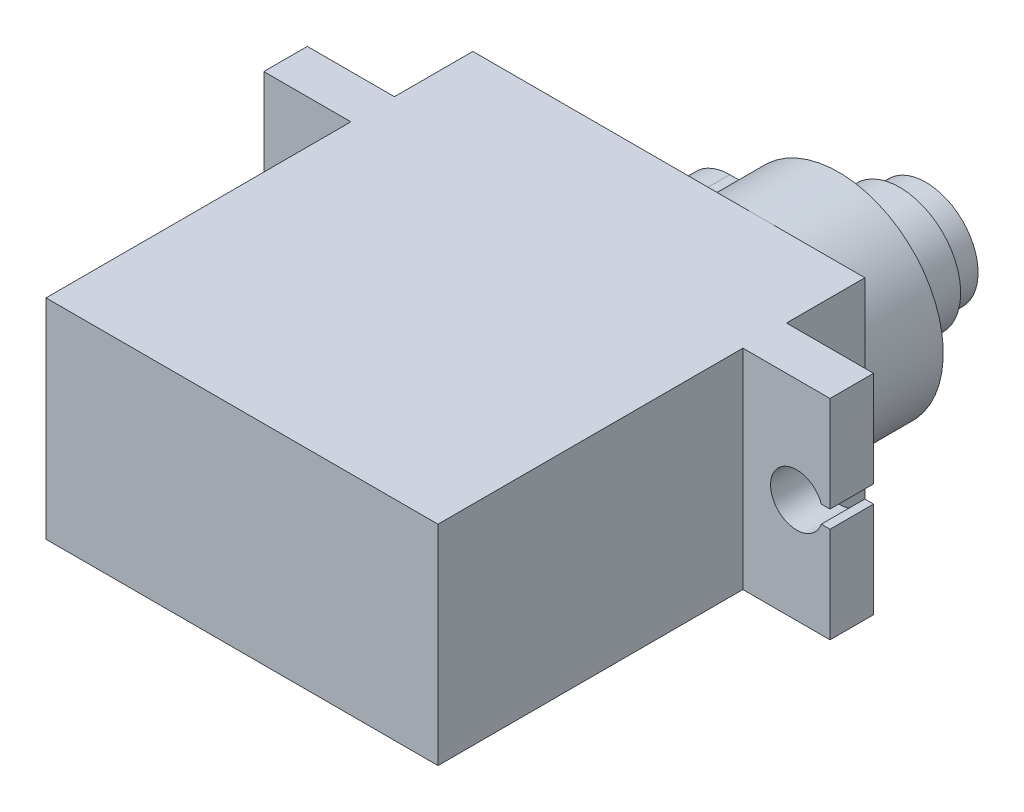
ISO-10303-21;
HEADER;
FILE_DESCRIPTION(('STEP AP214'),'2;1');
FILE_NAME('part.step','',(''),(''),'','','');
FILE_SCHEMA(('AUTOMOTIVE_DESIGN { 1 0 10303 214 1 1 1 1 }'));
ENDSEC;
DATA;
#1=APPLICATION_CONTEXT('core data for automotive mechanical design processes');
#2=APPLICATION_PROTOCOL_DEFINITION('international standard','automotive_design',2000,#1);
#3=PRODUCT_CONTEXT('',#1,'mechanical');
#4=PRODUCT('Part','Part','',(#3));
#5=PRODUCT_RELATED_PRODUCT_CATEGORY('part','',(#4));
#6=PRODUCT_DEFINITION_FORMATION('','',#4);
#7=PRODUCT_DEFINITION_CONTEXT('part definition',#1,'design');
#8=PRODUCT_DEFINITION('design','',#6,#7);
#9=PRODUCT_DEFINITION_SHAPE('','',#8);
#10=(LENGTH_UNIT() NAMED_UNIT(*) SI_UNIT(.MILLI.,.METRE.));
#11=(NAMED_UNIT(*) PLANE_ANGLE_UNIT() SI_UNIT($,.RADIAN.));
#12=(NAMED_UNIT(*) SI_UNIT($,.STERADIAN.) SOLID_ANGLE_UNIT());
#13=UNCERTAINTY_MEASURE_WITH_UNIT(LENGTH_MEASURE(1.E-05),#10,'distance_accuracy_value','');
#14=(GEOMETRIC_REPRESENTATION_CONTEXT(3) GLOBAL_UNCERTAINTY_ASSIGNED_CONTEXT((#13)) GLOBAL_UNIT_ASSIGNED_CONTEXT((#10,
#11,#12)) REPRESENTATION_CONTEXT('',''));
#15=CARTESIAN_POINT('',(0.,0.,0.));
#16=DIRECTION('',(0.,0.,1.));
#17=DIRECTION('',(1.,0.,0.));
#18=AXIS2_PLACEMENT_3D('',#15,#16,#17);
#19=CARTESIAN_POINT('',(5.25,0.,-14.));
#20=DIRECTION('',(0.,0.,1.));
#21=DIRECTION('',(1.,0.,0.));
#22=AXIS2_PLACEMENT_3D('',#19,#20,#21);
#23=CYLINDRICAL_SURFACE('',#22,3.5);
#24=CARTESIAN_POINT('',(5.25,0.,-9.));
#25=DIRECTION('',(0.,0.,-1.));
#26=DIRECTION('',(-1.,0.,0.));
#27=AXIS2_PLACEMENT_3D('',#24,#25,#26);
#28=CIRCLE('',#27,3.5);
#29=CARTESIAN_POINT('',(1.75,0.,-9.));
#30=VERTEX_POINT('',#29);
#31=EDGE_CURVE('E11',#30,#30,#28,.T.);
#32=ORIENTED_EDGE('',*,*,#31,.T.);
#33=EDGE_LOOP('',(#32));
#34=FACE_BOUND('',#33,.T.);
#35=CARTESIAN_POINT('',(5.25,0.,-12.5));
#36=DIRECTION('',(0.,0.,-1.));
#37=DIRECTION('',(-1.,0.,0.));
#38=AXIS2_PLACEMENT_3D('',#35,#36,#37);
#39=CIRCLE('',#38,3.5);
#40=CARTESIAN_POINT('',(1.75,0.,-12.5));
#41=VERTEX_POINT('',#40);
#42=EDGE_CURVE('E787',#41,#41,#39,.T.);
#43=ORIENTED_EDGE('',*,*,#42,.F.);
#44=EDGE_LOOP('',(#43));
#45=FACE_BOUND('',#44,.T.);
#46=ADVANCED_FACE('F35',(#34,#45),#23,.T.);
#47=CARTESIAN_POINT('',(0.,0.,-4.5));
#48=DIRECTION('',(0.,0.,1.));
#49=DIRECTION('',(1.,0.,0.));
#50=AXIS2_PLACEMENT_3D('',#47,#48,#49);
#51=PLANE('',#50);
#52=CARTESIAN_POINT('',(5.25,0.,-4.5));
#53=DIRECTION('',(0.,0.,-1.));
#54=DIRECTION('',(-1.,0.,0.));
#55=AXIS2_PLACEMENT_3D('',#52,#53,#54);
#56=CIRCLE('',#55,5.99999999999999);
#57=CARTESIAN_POINT('',(11.25,0.,-4.5));
#58=VERTEX_POINT('',#57);
#59=CARTESIAN_POINT('',(5.25,-6.,-4.5));
#60=VERTEX_POINT('',#59);
#61=EDGE_CURVE('E44',#58,#60,#56,.T.);
#62=ORIENTED_EDGE('',*,*,#61,.F.);
#63=DIRECTION('',(0.,-1.,0.));
#64=VECTOR('',#63,1.);
#65=CARTESIAN_POINT('',(11.25,-6.,-4.5));
#66=LINE('',#65,#64);
#67=CARTESIAN_POINT('',(11.25,-6.,-4.5));
#68=VERTEX_POINT('',#67);
#69=EDGE_CURVE('E243',#58,#68,#66,.T.);
#70=ORIENTED_EDGE('',*,*,#69,.T.);
#71=DIRECTION('',(-1.,0.,0.));
#72=VECTOR('',#71,1.);
#73=CARTESIAN_POINT('',(11.25,-6.,-4.5));
#74=LINE('',#73,#72);
#75=EDGE_CURVE('E248',#68,#60,#74,.T.);
#76=ORIENTED_EDGE('',*,*,#75,.T.);
#77=EDGE_LOOP('',(#62,#70,#76));
#78=FACE_BOUND('',#77,.T.);
#79=ADVANCED_FACE('F403',(#78),#51,.F.);
#80=CARTESIAN_POINT('',(-0.0826822519253796,-2.75,-4.5));
#81=VERTEX_POINT('',#80);
#82=EDGE_CURVE('E389',#60,#81,#56,.T.);
#83=ORIENTED_EDGE('',*,*,#82,.F.);
#84=CARTESIAN_POINT('',(-11.25,-6.,-4.5));
#85=VERTEX_POINT('',#84);
#86=EDGE_CURVE('E247',#60,#85,#74,.T.);
#87=ORIENTED_EDGE('',*,*,#86,.T.);
#88=DIRECTION('',(0.,1.,0.));
#89=VECTOR('',#88,1.);
#90=CARTESIAN_POINT('',(-11.25,-6.,-4.5));
#91=LINE('',#90,#89);
#92=CARTESIAN_POINT('',(-11.25,6.,-4.5));
#93=VERTEX_POINT('',#92);
#94=EDGE_CURVE('E236',#85,#93,#91,.T.);
#95=ORIENTED_EDGE('',*,*,#94,.T.);
#96=DIRECTION('',(1.,0.,0.));
#97=VECTOR('',#96,1.);
#98=CARTESIAN_POINT('',(11.25,6.,-4.5));
#99=LINE('',#98,#97);
#100=CARTESIAN_POINT('',(5.25,6.,-4.5));
#101=VERTEX_POINT('',#100);
#102=EDGE_CURVE('E240',#93,#101,#99,.T.);
#103=ORIENTED_EDGE('',*,*,#102,.T.);
#104=CARTESIAN_POINT('',(-0.0826822519253674,2.75,-4.5));
#105=VERTEX_POINT('',#104);
#106=EDGE_CURVE('E391',#105,#101,#56,.T.);
#107=ORIENTED_EDGE('',*,*,#106,.F.);
#108=DIRECTION('',(1.,0.,0.));
#109=VECTOR('',#108,1.);
#110=CARTESIAN_POINT('',(-0.99999999999999,2.75,-4.5));
#111=LINE('',#110,#109);
#112=CARTESIAN_POINT('',(-0.99999999999999,2.75,-4.5));
#113=VERTEX_POINT('',#112);
#114=EDGE_CURVE('E397',#113,#105,#111,.T.);
#115=ORIENTED_EDGE('',*,*,#114,.F.);
#116=CARTESIAN_POINT('',(-1.,0.,-4.5));
#117=DIRECTION('',(0.,0.,-1.));
#118=DIRECTION('',(-1.,0.,0.));
#119=AXIS2_PLACEMENT_3D('',#116,#117,#118);
#120=CIRCLE('',#119,2.75);
#121=CARTESIAN_POINT('',(-1.00000000000003,-2.75,-4.5));
#122=VERTEX_POINT('',#121);
#123=EDGE_CURVE('E57',#122,#113,#120,.T.);
#124=ORIENTED_EDGE('',*,*,#123,.F.);
#125=DIRECTION('',(-1.,0.,0.));
#126=VECTOR('',#125,1.);
#127=CARTESIAN_POINT('',(-1.00000000000003,-2.75,-4.5));
#128=LINE('',#127,#126);
#129=EDGE_CURVE('E52',#81,#122,#128,.T.);
#130=ORIENTED_EDGE('',*,*,#129,.F.);
#131=EDGE_LOOP('',(#83,#87,#95,#103,#107,#115,#124,#130));
#132=FACE_BOUND('',#131,.T.);
#133=ADVANCED_FACE('F422',(#132),#51,.F.);
#134=EDGE_CURVE('E384',#101,#58,#56,.T.);
#135=ORIENTED_EDGE('',*,*,#134,.F.);
#136=CARTESIAN_POINT('',(11.25,6.,-4.5));
#137=VERTEX_POINT('',#136);
#138=EDGE_CURVE('E239',#101,#137,#99,.T.);
#139=ORIENTED_EDGE('',*,*,#138,.T.);
#140=EDGE_CURVE('E244',#137,#58,#66,.T.);
#141=ORIENTED_EDGE('',*,*,#140,.T.);
#142=EDGE_LOOP('',(#135,#139,#141));
#143=FACE_BOUND('',#142,.T.);
#144=ADVANCED_FACE('F410',(#143),#51,.F.);
#145=CARTESIAN_POINT('',(-14.3357864376269,0.,0.));
#146=DIRECTION('',(0.,0.,1.));
#147=DIRECTION('',(1.,0.,0.));
#148=AXIS2_PLACEMENT_3D('',#145,#146,#147);
#149=PLANE('',#148);
#150=DIRECTION('',(0.,1.,0.));
#151=VECTOR('',#150,1.);
#152=CARTESIAN_POINT('',(-11.25,-6.,0.));
#153=LINE('',#152,#151);
#154=CARTESIAN_POINT('',(-11.25,-6.,0.));
#155=VERTEX_POINT('',#154);
#156=CARTESIAN_POINT('',(-11.25,5.99999999999999,0.));
#157=VERTEX_POINT('',#156);
#158=EDGE_CURVE('E227',#155,#157,#153,.T.);
#159=ORIENTED_EDGE('',*,*,#158,.F.);
#160=DIRECTION('',(1.,0.,0.));
#161=VECTOR('',#160,1.);
#162=CARTESIAN_POINT('',(-16.25,-6.,0.));
#163=LINE('',#162,#161);
#164=CARTESIAN_POINT('',(-16.25,-6.,0.));
#165=VERTEX_POINT('',#164);
#166=EDGE_CURVE('E346',#165,#155,#163,.T.);
#167=ORIENTED_EDGE('',*,*,#166,.F.);
#168=DIRECTION('',(0.,-1.,0.));
#169=VECTOR('',#168,1.);
#170=CARTESIAN_POINT('',(-16.25,-6.,0.));
#171=LINE('',#170,#169);
#172=CARTESIAN_POINT('',(-16.25,-0.500000000000002,0.));
#173=VERTEX_POINT('',#172);
#174=EDGE_CURVE('E343',#173,#165,#171,.T.);
#175=ORIENTED_EDGE('',*,*,#174,.F.);
#176=DIRECTION('',(-1.,0.,0.));
#177=VECTOR('',#176,1.);
#178=CARTESIAN_POINT('',(-15.75,-0.500000000000002,0.));
#179=LINE('',#178,#177);
#180=CARTESIAN_POINT('',(-15.75,-0.500000000000001,0.));
#181=VERTEX_POINT('',#180);
#182=EDGE_CURVE('E341',#181,#173,#179,.T.);
#183=ORIENTED_EDGE('',*,*,#182,.F.);
#184=CARTESIAN_POINT('',(-14.3357864376269,0.,0.));
#185=DIRECTION('',(0.,0.,-1.));
#186=DIRECTION('',(1.,0.,0.));
#187=AXIS2_PLACEMENT_3D('',#184,#185,#186);
#188=CIRCLE('',#187,1.5);
#189=CARTESIAN_POINT('',(-15.75,0.499999999999998,0.));
#190=VERTEX_POINT('',#189);
#191=EDGE_CURVE('E339',#190,#181,#188,.T.);
#192=ORIENTED_EDGE('',*,*,#191,.F.);
#193=DIRECTION('',(1.,0.,0.));
#194=VECTOR('',#193,1.);
#195=CARTESIAN_POINT('',(-15.75,0.499999999999998,0.));
#196=LINE('',#195,#194);
#197=CARTESIAN_POINT('',(-16.25,0.499999999999998,0.));
#198=VERTEX_POINT('',#197);
#199=EDGE_CURVE('E337',#198,#190,#196,.T.);
#200=ORIENTED_EDGE('',*,*,#199,.F.);
#201=DIRECTION('',(0.,-1.,0.));
#202=VECTOR('',#201,1.);
#203=CARTESIAN_POINT('',(-16.25,0.499999999999998,0.));
#204=LINE('',#203,#202);
#205=CARTESIAN_POINT('',(-16.25,6.,0.));
#206=VERTEX_POINT('',#205);
#207=EDGE_CURVE('E335',#206,#198,#204,.T.);
#208=ORIENTED_EDGE('',*,*,#207,.F.);
#209=DIRECTION('',(-1.,0.,0.));
#210=VECTOR('',#209,1.);
#211=CARTESIAN_POINT('',(-16.25,6.,0.));
#212=LINE('',#211,#210);
#213=EDGE_CURVE('E331',#157,#206,#212,.T.);
#214=ORIENTED_EDGE('',*,*,#213,.F.);
#215=EDGE_LOOP('',(#159,#167,#175,#183,#192,#200,#208,#214));
#216=FACE_BOUND('',#215,.T.);
#217=ADVANCED_FACE('F435',(#216),#149,.F.);
#218=DIRECTION('',(0.,-1.,0.));
#219=VECTOR('',#218,1.);
#220=CARTESIAN_POINT('',(11.25,-6.,0.));
#221=LINE('',#220,#219);
#222=CARTESIAN_POINT('',(11.25,5.99999999999998,0.));
#223=VERTEX_POINT('',#222);
#224=CARTESIAN_POINT('',(11.25,-6.,0.));
#225=VERTEX_POINT('',#224);
#226=EDGE_CURVE('E230',#223,#225,#221,.T.);
#227=ORIENTED_EDGE('',*,*,#226,.F.);
#228=CARTESIAN_POINT('',(16.25,5.99999999999999,0.));
#229=VERTEX_POINT('',#228);
#230=EDGE_CURVE('E332',#229,#223,#212,.T.);
#231=ORIENTED_EDGE('',*,*,#230,.F.);
#232=DIRECTION('',(0.,1.,0.));
#233=VECTOR('',#232,1.);
#234=CARTESIAN_POINT('',(16.25,0.5,0.));
#235=LINE('',#234,#233);
#236=CARTESIAN_POINT('',(16.25,0.5,0.));
#237=VERTEX_POINT('',#236);
#238=EDGE_CURVE('E328',#237,#229,#235,.T.);
#239=ORIENTED_EDGE('',*,*,#238,.F.);
#240=DIRECTION('',(1.,0.,0.));
#241=VECTOR('',#240,1.);
#242=CARTESIAN_POINT('',(15.75,0.5,0.));
#243=LINE('',#242,#241);
#244=CARTESIAN_POINT('',(15.75,0.5,0.));
#245=VERTEX_POINT('',#244);
#246=EDGE_CURVE('E326',#245,#237,#243,.T.);
#247=ORIENTED_EDGE('',*,*,#246,.F.);
#248=CARTESIAN_POINT('',(14.3357864376269,0.,0.));
#249=DIRECTION('',(0.,0.,-1.));
#250=DIRECTION('',(-1.,0.,0.));
#251=AXIS2_PLACEMENT_3D('',#248,#249,#250);
#252=CIRCLE('',#251,1.5);
#253=CARTESIAN_POINT('',(15.75,-0.5,0.));
#254=VERTEX_POINT('',#253);
#255=EDGE_CURVE('E324',#254,#245,#252,.T.);
#256=ORIENTED_EDGE('',*,*,#255,.F.);
#257=DIRECTION('',(-1.,0.,0.));
#258=VECTOR('',#257,1.);
#259=CARTESIAN_POINT('',(15.75,-0.5,0.));
#260=LINE('',#259,#258);
#261=CARTESIAN_POINT('',(16.25,-0.5,0.));
#262=VERTEX_POINT('',#261);
#263=EDGE_CURVE('E322',#262,#254,#260,.T.);
#264=ORIENTED_EDGE('',*,*,#263,.F.);
#265=DIRECTION('',(0.,1.,0.));
#266=VECTOR('',#265,1.);
#267=CARTESIAN_POINT('',(16.25,-6.,0.));
#268=LINE('',#267,#266);
#269=CARTESIAN_POINT('',(16.25,-6.,0.));
#270=VERTEX_POINT('',#269);
#271=EDGE_CURVE('E292',#270,#262,#268,.T.);
#272=ORIENTED_EDGE('',*,*,#271,.F.);
#273=EDGE_CURVE('E345',#225,#270,#163,.T.);
#274=ORIENTED_EDGE('',*,*,#273,.F.);
#275=EDGE_LOOP('',(#227,#231,#239,#247,#256,#264,#272,#274));
#276=FACE_BOUND('',#275,.T.);
#277=ADVANCED_FACE('F524',(#276),#149,.F.);
#278=CARTESIAN_POINT('',(-14.3357864376269,0.,2.5));
#279=DIRECTION('',(0.,0.,1.));
#280=DIRECTION('',(1.,0.,0.));
#281=AXIS2_PLACEMENT_3D('',#278,#279,#280);
#282=PLANE('',#281);
#283=DIRECTION('',(0.,1.,0.));
#284=VECTOR('',#283,1.);
#285=CARTESIAN_POINT('',(11.25,-5.99999999999999,2.5));
#286=LINE('',#285,#284);
#287=CARTESIAN_POINT('',(11.25,-6.,2.5));
#288=VERTEX_POINT('',#287);
#289=CARTESIAN_POINT('',(11.25,5.99999999999999,2.5));
#290=VERTEX_POINT('',#289);
#291=EDGE_CURVE('E265',#288,#290,#286,.T.);
#292=ORIENTED_EDGE('',*,*,#291,.F.);
#293=DIRECTION('',(1.,0.,0.));
#294=VECTOR('',#293,1.);
#295=CARTESIAN_POINT('',(16.25,-6.,2.5));
#296=LINE('',#295,#294);
#297=CARTESIAN_POINT('',(16.25,-6.,2.5));
#298=VERTEX_POINT('',#297);
#299=EDGE_CURVE('E296',#288,#298,#296,.T.);
#300=ORIENTED_EDGE('',*,*,#299,.T.);
#301=DIRECTION('',(0.,1.,0.));
#302=VECTOR('',#301,1.);
#303=CARTESIAN_POINT('',(16.25,-6.,2.5));
#304=LINE('',#303,#302);
#305=CARTESIAN_POINT('',(16.25,-0.5,2.5));
#306=VERTEX_POINT('',#305);
#307=EDGE_CURVE('E295',#298,#306,#304,.T.);
#308=ORIENTED_EDGE('',*,*,#307,.T.);
#309=DIRECTION('',(-1.,0.,0.));
#310=VECTOR('',#309,1.);
#311=CARTESIAN_POINT('',(15.75,-0.5,2.5));
#312=LINE('',#311,#310);
#313=CARTESIAN_POINT('',(15.75,-0.5,2.5));
#314=VERTEX_POINT('',#313);
#315=EDGE_CURVE('E298',#306,#314,#312,.T.);
#316=ORIENTED_EDGE('',*,*,#315,.T.);
#317=CARTESIAN_POINT('',(14.3357864376269,0.,2.5));
#318=DIRECTION('',(0.,0.,-1.));
#319=DIRECTION('',(-1.,0.,0.));
#320=AXIS2_PLACEMENT_3D('',#317,#318,#319);
#321=CIRCLE('',#320,1.5);
#322=CARTESIAN_POINT('',(15.75,0.5,2.5));
#323=VERTEX_POINT('',#322);
#324=EDGE_CURVE('E300',#314,#323,#321,.T.);
#325=ORIENTED_EDGE('',*,*,#324,.T.);
#326=DIRECTION('',(1.,0.,0.));
#327=VECTOR('',#326,1.);
#328=CARTESIAN_POINT('',(15.75,0.5,2.5));
#329=LINE('',#328,#327);
#330=CARTESIAN_POINT('',(16.25,0.5,2.5));
#331=VERTEX_POINT('',#330);
#332=EDGE_CURVE('E302',#323,#331,#329,.T.);
#333=ORIENTED_EDGE('',*,*,#332,.T.);
#334=DIRECTION('',(0.,1.,0.));
#335=VECTOR('',#334,1.);
#336=CARTESIAN_POINT('',(16.25,0.5,2.5));
#337=LINE('',#336,#335);
#338=CARTESIAN_POINT('',(16.25,5.99999999999999,2.5));
#339=VERTEX_POINT('',#338);
#340=EDGE_CURVE('E304',#331,#339,#337,.T.);
#341=ORIENTED_EDGE('',*,*,#340,.T.);
#342=DIRECTION('',(-1.,0.,0.));
#343=VECTOR('',#342,1.);
#344=CARTESIAN_POINT('',(16.25,5.99999999999999,2.5));
#345=LINE('',#344,#343);
#346=EDGE_CURVE('E307',#339,#290,#345,.T.);
#347=ORIENTED_EDGE('',*,*,#346,.T.);
#348=EDGE_LOOP('',(#292,#300,#308,#316,#325,#333,#341,#347));
#349=FACE_BOUND('',#348,.T.);
#350=ADVANCED_FACE('F466',(#349),#282,.T.);
#351=CARTESIAN_POINT('',(16.25,-6.,2.5));
#352=DIRECTION('',(-1.,0.,0.));
#353=DIRECTION('',(0.,0.,1.));
#354=AXIS2_PLACEMENT_3D('',#351,#352,#353);
#355=PLANE('',#354);
#356=ORIENTED_EDGE('',*,*,#271,.T.);
#357=DIRECTION('',(0.,0.,-1.));
#358=VECTOR('',#357,1.);
#359=CARTESIAN_POINT('',(16.25,-0.5,2.5));
#360=LINE('',#359,#358);
#361=EDGE_CURVE('E377',#306,#262,#360,.T.);
#362=ORIENTED_EDGE('',*,*,#361,.F.);
#363=ORIENTED_EDGE('',*,*,#307,.F.);
#364=DIRECTION('',(0.,0.,-1.));
#365=VECTOR('',#364,1.);
#366=CARTESIAN_POINT('',(16.25,-6.,2.5));
#367=LINE('',#366,#365);
#368=EDGE_CURVE('E39',#298,#270,#367,.T.);
#369=ORIENTED_EDGE('',*,*,#368,.T.);
#370=EDGE_LOOP('',(#356,#362,#363,#369));
#371=FACE_BOUND('',#370,.T.);
#372=ADVANCED_FACE('F37',(#371),#355,.F.);
#373=CARTESIAN_POINT('',(15.75,-0.5,2.5));
#374=DIRECTION('',(0.,-1.,0.));
#375=DIRECTION('',(1.,0.,0.));
#376=AXIS2_PLACEMENT_3D('',#373,#374,#375);
#377=PLANE('',#376);
#378=ORIENTED_EDGE('',*,*,#263,.T.);
#379=DIRECTION('',(0.,0.,-1.));
#380=VECTOR('',#379,1.);
#381=CARTESIAN_POINT('',(15.75,-0.5,2.5));
#382=LINE('',#381,#380);
#383=EDGE_CURVE('E375',#314,#254,#382,.T.);
#384=ORIENTED_EDGE('',*,*,#383,.F.);
#385=ORIENTED_EDGE('',*,*,#315,.F.);
#386=ORIENTED_EDGE('',*,*,#361,.T.);
#387=EDGE_LOOP('',(#378,#384,#385,#386));
#388=FACE_BOUND('',#387,.T.);
#389=ADVANCED_FACE('F740',(#388),#377,.F.);
#390=CARTESIAN_POINT('',(14.3357864376269,0.,2.5));
#391=DIRECTION('',(0.,0.,-1.));
#392=DIRECTION('',(-1.,0.,0.));
#393=AXIS2_PLACEMENT_3D('',#390,#391,#392);
#394=CYLINDRICAL_SURFACE('',#393,1.5);
#395=ORIENTED_EDGE('',*,*,#255,.T.);
#396=DIRECTION('',(0.,0.,-1.));
#397=VECTOR('',#396,1.);
#398=CARTESIAN_POINT('',(15.75,0.5,2.5));
#399=LINE('',#398,#397);
#400=EDGE_CURVE('E372',#323,#245,#399,.T.);
#401=ORIENTED_EDGE('',*,*,#400,.F.);
#402=ORIENTED_EDGE('',*,*,#324,.F.);
#403=ORIENTED_EDGE('',*,*,#383,.T.);
#404=EDGE_LOOP('',(#395,#401,#402,#403));
#405=FACE_BOUND('',#404,.T.);
#406=ADVANCED_FACE('F730',(#405),#394,.F.);
#407=CARTESIAN_POINT('',(15.75,0.5,2.5));
#408=DIRECTION('',(0.,1.,0.));
#409=DIRECTION('',(-1.,0.,0.));
#410=AXIS2_PLACEMENT_3D('',#407,#408,#409);
#411=PLANE('',#410);
#412=ORIENTED_EDGE('',*,*,#246,.T.);
#413=DIRECTION('',(0.,0.,-1.));
#414=VECTOR('',#413,1.);
#415=CARTESIAN_POINT('',(16.25,0.5,2.5));
#416=LINE('',#415,#414);
#417=EDGE_CURVE('E369',#331,#237,#416,.T.);
#418=ORIENTED_EDGE('',*,*,#417,.F.);
#419=ORIENTED_EDGE('',*,*,#332,.F.);
#420=ORIENTED_EDGE('',*,*,#400,.T.);
#421=EDGE_LOOP('',(#412,#418,#419,#420));
#422=FACE_BOUND('',#421,.T.);
#423=ADVANCED_FACE('F719',(#422),#411,.F.);
#424=CARTESIAN_POINT('',(16.25,0.5,2.5));
#425=DIRECTION('',(-1.,0.,0.));
#426=DIRECTION('',(0.,0.,1.));
#427=AXIS2_PLACEMENT_3D('',#424,#425,#426);
#428=PLANE('',#427);
#429=ORIENTED_EDGE('',*,*,#238,.T.);
#430=DIRECTION('',(0.,0.,-1.));
#431=VECTOR('',#430,1.);
#432=CARTESIAN_POINT('',(16.25,5.99999999999999,2.5));
#433=LINE('',#432,#431);
#434=EDGE_CURVE('E366',#339,#229,#433,.T.);
#435=ORIENTED_EDGE('',*,*,#434,.F.);
#436=ORIENTED_EDGE('',*,*,#340,.F.);
#437=ORIENTED_EDGE('',*,*,#417,.T.);
#438=EDGE_LOOP('',(#429,#435,#436,#437));
#439=FACE_BOUND('',#438,.T.);
#440=ADVANCED_FACE('F646',(#439),#428,.F.);
#441=CARTESIAN_POINT('',(-16.25,6.,2.5));
#442=DIRECTION('',(0.,-1.,0.));
#443=DIRECTION('',(1.,0.,0.));
#444=AXIS2_PLACEMENT_3D('',#441,#442,#443);
#445=PLANE('',#444);
#446=ORIENTED_EDGE('',*,*,#230,.T.);
#447=DIRECTION('',(0.,0.,1.));
#448=VECTOR('',#447,1.);
#449=CARTESIAN_POINT('',(11.25,6.,-4.5));
#450=LINE('',#449,#448);
#451=EDGE_CURVE('E259',#137,#223,#450,.T.);
#452=ORIENTED_EDGE('',*,*,#451,.F.);
#453=ORIENTED_EDGE('',*,*,#138,.F.);
#454=ORIENTED_EDGE('',*,*,#102,.F.);
#455=DIRECTION('',(0.,0.,1.));
#456=VECTOR('',#455,1.);
#457=CARTESIAN_POINT('',(-11.25,6.,-4.5));
#458=LINE('',#457,#456);
#459=EDGE_CURVE('E262',#93,#157,#458,.T.);
#460=ORIENTED_EDGE('',*,*,#459,.T.);
#461=ORIENTED_EDGE('',*,*,#213,.T.);
#462=DIRECTION('',(0.,0.,-1.));
#463=VECTOR('',#462,1.);
#464=CARTESIAN_POINT('',(-16.25,6.,2.5));
#465=LINE('',#464,#463);
#466=CARTESIAN_POINT('',(-16.25,6.,2.5));
#467=VERTEX_POINT('',#466);
#468=EDGE_CURVE('E363',#467,#206,#465,.T.);
#469=ORIENTED_EDGE('',*,*,#468,.F.);
#470=CARTESIAN_POINT('',(-11.25,5.99999999999999,2.5));
#471=VERTEX_POINT('',#470);
#472=EDGE_CURVE('E306',#471,#467,#345,.T.);
#473=ORIENTED_EDGE('',*,*,#472,.F.);
#474=DIRECTION('',(0.,0.,-1.));
#475=VECTOR('',#474,1.);
#476=CARTESIAN_POINT('',(-11.25,5.99999999999999,20.));
#477=LINE('',#476,#475);
#478=CARTESIAN_POINT('',(-11.25,5.99999999999999,20.));
#479=VERTEX_POINT('',#478);
#480=EDGE_CURVE('E286',#479,#471,#477,.T.);
#481=ORIENTED_EDGE('',*,*,#480,.F.);
#482=DIRECTION('',(-1.,0.,0.));
#483=VECTOR('',#482,1.);
#484=CARTESIAN_POINT('',(-11.25,5.99999999999999,20.));
#485=LINE('',#484,#483);
#486=CARTESIAN_POINT('',(11.25,5.99999999999999,20.));
#487=VERTEX_POINT('',#486);
#488=EDGE_CURVE('E269',#487,#479,#485,.T.);
#489=ORIENTED_EDGE('',*,*,#488,.F.);
#490=DIRECTION('',(0.,0.,-1.));
#491=VECTOR('',#490,1.);
#492=CARTESIAN_POINT('',(11.25,5.99999999999999,20.));
#493=LINE('',#492,#491);
#494=EDGE_CURVE('E289',#487,#290,#493,.T.);
#495=ORIENTED_EDGE('',*,*,#494,.T.);
#496=ORIENTED_EDGE('',*,*,#346,.F.);
#497=ORIENTED_EDGE('',*,*,#434,.T.);
#498=EDGE_LOOP('',(#446,#452,#453,#454,#460,#461,#469,#473,#481,#489,#495,#496,#497));
#499=FACE_BOUND('',#498,.T.);
#500=ADVANCED_FACE('F414',(#499),#445,.F.);
#501=CARTESIAN_POINT('',(-16.25,0.499999999999998,2.5));
#502=DIRECTION('',(1.,0.,0.));
#503=DIRECTION('',(0.,0.,-1.));
#504=AXIS2_PLACEMENT_3D('',#501,#502,#503);
#505=PLANE('',#504);
#506=ORIENTED_EDGE('',*,*,#207,.T.);
#507=DIRECTION('',(0.,0.,-1.));
#508=VECTOR('',#507,1.);
#509=CARTESIAN_POINT('',(-16.25,0.499999999999998,2.5));
#510=LINE('',#509,#508);
#511=CARTESIAN_POINT('',(-16.25,0.499999999999998,2.5));
#512=VERTEX_POINT('',#511);
#513=EDGE_CURVE('E360',#512,#198,#510,.T.);
#514=ORIENTED_EDGE('',*,*,#513,.F.);
#515=DIRECTION('',(0.,-1.,0.));
#516=VECTOR('',#515,1.);
#517=CARTESIAN_POINT('',(-16.25,0.499999999999998,2.5));
#518=LINE('',#517,#516);
#519=EDGE_CURVE('E309',#467,#512,#518,.T.);
#520=ORIENTED_EDGE('',*,*,#519,.F.);
#521=ORIENTED_EDGE('',*,*,#468,.T.);
#522=EDGE_LOOP('',(#506,#514,#520,#521));
#523=FACE_BOUND('',#522,.T.);
#524=ADVANCED_FACE('F432',(#523),#505,.F.);
#525=CARTESIAN_POINT('',(-15.75,0.499999999999998,2.5));
#526=DIRECTION('',(0.,1.,0.));
#527=DIRECTION('',(-1.,0.,0.));
#528=AXIS2_PLACEMENT_3D('',#525,#526,#527);
#529=PLANE('',#528);
#530=ORIENTED_EDGE('',*,*,#199,.T.);
#531=DIRECTION('',(0.,0.,-1.));
#532=VECTOR('',#531,1.);
#533=CARTESIAN_POINT('',(-15.75,0.499999999999998,2.5));
#534=LINE('',#533,#532);
#535=CARTESIAN_POINT('',(-15.75,0.499999999999998,2.5));
#536=VERTEX_POINT('',#535);
#537=EDGE_CURVE('E357',#536,#190,#534,.T.);
#538=ORIENTED_EDGE('',*,*,#537,.F.);
#539=DIRECTION('',(1.,0.,0.));
#540=VECTOR('',#539,1.);
#541=CARTESIAN_POINT('',(-15.75,0.499999999999998,2.5));
#542=LINE('',#541,#540);
#543=EDGE_CURVE('E311',#512,#536,#542,.T.);
#544=ORIENTED_EDGE('',*,*,#543,.F.);
#545=ORIENTED_EDGE('',*,*,#513,.T.);
#546=EDGE_LOOP('',(#530,#538,#544,#545));
#547=FACE_BOUND('',#546,.T.);
#548=ADVANCED_FACE('F440',(#547),#529,.F.);
#549=CARTESIAN_POINT('',(-14.3357864376269,0.,2.5));
#550=DIRECTION('',(0.,0.,-1.));
#551=DIRECTION('',(-1.,0.,0.));
#552=AXIS2_PLACEMENT_3D('',#549,#550,#551);
#553=CYLINDRICAL_SURFACE('',#552,1.5);
#554=ORIENTED_EDGE('',*,*,#191,.T.);
#555=DIRECTION('',(0.,0.,-1.));
#556=VECTOR('',#555,1.);
#557=CARTESIAN_POINT('',(-15.75,-0.500000000000001,2.5));
#558=LINE('',#557,#556);
#559=CARTESIAN_POINT('',(-15.75,-0.500000000000001,2.5));
#560=VERTEX_POINT('',#559);
#561=EDGE_CURVE('E354',#560,#181,#558,.T.);
#562=ORIENTED_EDGE('',*,*,#561,.F.);
#563=CARTESIAN_POINT('',(-14.3357864376269,0.,2.5));
#564=DIRECTION('',(0.,0.,-1.));
#565=DIRECTION('',(1.,0.,0.));
#566=AXIS2_PLACEMENT_3D('',#563,#564,#565);
#567=CIRCLE('',#566,1.5);
#568=EDGE_CURVE('E313',#536,#560,#567,.T.);
#569=ORIENTED_EDGE('',*,*,#568,.F.);
#570=ORIENTED_EDGE('',*,*,#537,.T.);
#571=EDGE_LOOP('',(#554,#562,#569,#570));
#572=FACE_BOUND('',#571,.T.);
#573=ADVANCED_FACE('F444',(#572),#553,.F.);
#574=CARTESIAN_POINT('',(-15.75,-0.500000000000002,2.5));
#575=DIRECTION('',(0.,-1.,0.));
#576=DIRECTION('',(1.,0.,0.));
#577=AXIS2_PLACEMENT_3D('',#574,#575,#576);
#578=PLANE('',#577);
#579=ORIENTED_EDGE('',*,*,#182,.T.);
#580=DIRECTION('',(0.,0.,-1.));
#581=VECTOR('',#580,1.);
#582=CARTESIAN_POINT('',(-16.25,-0.500000000000002,2.5));
#583=LINE('',#582,#581);
#584=CARTESIAN_POINT('',(-16.25,-0.500000000000002,2.5));
#585=VERTEX_POINT('',#584);
#586=EDGE_CURVE('E351',#585,#173,#583,.T.);
#587=ORIENTED_EDGE('',*,*,#586,.F.);
#588=DIRECTION('',(-1.,0.,0.));
#589=VECTOR('',#588,1.);
#590=CARTESIAN_POINT('',(-15.75,-0.500000000000002,2.5));
#591=LINE('',#590,#589);
#592=EDGE_CURVE('E315',#560,#585,#591,.T.);
#593=ORIENTED_EDGE('',*,*,#592,.F.);
#594=ORIENTED_EDGE('',*,*,#561,.T.);
#595=EDGE_LOOP('',(#579,#587,#593,#594));
#596=FACE_BOUND('',#595,.T.);
#597=ADVANCED_FACE('F474',(#596),#578,.F.);
#598=CARTESIAN_POINT('',(-16.25,-6.,2.5));
#599=DIRECTION('',(1.,0.,0.));
#600=DIRECTION('',(0.,0.,-1.));
#601=AXIS2_PLACEMENT_3D('',#598,#599,#600);
#602=PLANE('',#601);
#603=ORIENTED_EDGE('',*,*,#174,.T.);
#604=DIRECTION('',(0.,0.,-1.));
#605=VECTOR('',#604,1.);
#606=CARTESIAN_POINT('',(-16.25,-6.,2.5));
#607=LINE('',#606,#605);
#608=CARTESIAN_POINT('',(-16.25,-6.,2.5));
#609=VERTEX_POINT('',#608);
#610=EDGE_CURVE('E320',#609,#165,#607,.T.);
#611=ORIENTED_EDGE('',*,*,#610,.F.);
#612=DIRECTION('',(0.,-1.,0.));
#613=VECTOR('',#612,1.);
#614=CARTESIAN_POINT('',(-16.25,-6.,2.5));
#615=LINE('',#614,#613);
#616=EDGE_CURVE('E317',#585,#609,#615,.T.);
#617=ORIENTED_EDGE('',*,*,#616,.F.);
#618=ORIENTED_EDGE('',*,*,#586,.T.);
#619=EDGE_LOOP('',(#603,#611,#617,#618));
#620=FACE_BOUND('',#619,.T.);
#621=ADVANCED_FACE('F471',(#620),#602,.F.);
#622=CARTESIAN_POINT('',(-16.25,-6.,2.5));
#623=DIRECTION('',(0.,1.,0.));
#624=DIRECTION('',(-1.,0.,0.));
#625=AXIS2_PLACEMENT_3D('',#622,#623,#624);
#626=PLANE('',#625);
#627=ORIENTED_EDGE('',*,*,#166,.T.);
#628=DIRECTION('',(0.,0.,1.));
#629=VECTOR('',#628,1.);
#630=CARTESIAN_POINT('',(-11.25,-6.,-4.5));
#631=LINE('',#630,#629);
#632=EDGE_CURVE('E250',#85,#155,#631,.T.);
#633=ORIENTED_EDGE('',*,*,#632,.F.);
#634=ORIENTED_EDGE('',*,*,#86,.F.);
#635=ORIENTED_EDGE('',*,*,#75,.F.);
#636=DIRECTION('',(0.,0.,1.));
#637=VECTOR('',#636,1.);
#638=CARTESIAN_POINT('',(11.25,-6.,-4.5));
#639=LINE('',#638,#637);
#640=EDGE_CURVE('E256',#68,#225,#639,.T.);
#641=ORIENTED_EDGE('',*,*,#640,.T.);
#642=ORIENTED_EDGE('',*,*,#273,.T.);
#643=ORIENTED_EDGE('',*,*,#368,.F.);
#644=ORIENTED_EDGE('',*,*,#299,.F.);
#645=DIRECTION('',(0.,0.,-1.));
#646=VECTOR('',#645,1.);
#647=CARTESIAN_POINT('',(11.25,-5.99999999999999,20.));
#648=LINE('',#647,#646);
#649=CARTESIAN_POINT('',(11.25,-5.99999999999999,20.));
#650=VERTEX_POINT('',#649);
#651=EDGE_CURVE('E276',#650,#288,#648,.T.);
#652=ORIENTED_EDGE('',*,*,#651,.F.);
#653=DIRECTION('',(1.,0.,0.));
#654=VECTOR('',#653,1.);
#655=CARTESIAN_POINT('',(-11.25,-5.99999999999999,20.));
#656=LINE('',#655,#654);
#657=CARTESIAN_POINT('',(-11.25,-5.99999999999999,20.));
#658=VERTEX_POINT('',#657);
#659=EDGE_CURVE('E274',#658,#650,#656,.T.);
#660=ORIENTED_EDGE('',*,*,#659,.F.);
#661=DIRECTION('',(0.,0.,-1.));
#662=VECTOR('',#661,1.);
#663=CARTESIAN_POINT('',(-11.25,-5.99999999999999,20.));
#664=LINE('',#663,#662);
#665=CARTESIAN_POINT('',(-11.25,-5.99999999999999,2.5));
#666=VERTEX_POINT('',#665);
#667=EDGE_CURVE('E283',#658,#666,#664,.T.);
#668=ORIENTED_EDGE('',*,*,#667,.T.);
#669=EDGE_CURVE('E293',#609,#666,#296,.T.);
#670=ORIENTED_EDGE('',*,*,#669,.F.);
#671=ORIENTED_EDGE('',*,*,#610,.T.);
#672=EDGE_LOOP('',(#627,#633,#634,#635,#641,#642,#643,#644,#652,#660,#668,#670,#671));
#673=FACE_BOUND('',#672,.T.);
#674=ADVANCED_FACE('F417',(#673),#626,.F.);
#675=DIRECTION('',(0.,-1.,0.));
#676=VECTOR('',#675,1.);
#677=CARTESIAN_POINT('',(-11.25,-5.99999999999999,2.5));
#678=LINE('',#677,#676);
#679=EDGE_CURVE('E270',#471,#666,#678,.T.);
#680=ORIENTED_EDGE('',*,*,#679,.F.);
#681=ORIENTED_EDGE('',*,*,#472,.T.);
#682=ORIENTED_EDGE('',*,*,#519,.T.);
#683=ORIENTED_EDGE('',*,*,#543,.T.);
#684=ORIENTED_EDGE('',*,*,#568,.T.);
#685=ORIENTED_EDGE('',*,*,#592,.T.);
#686=ORIENTED_EDGE('',*,*,#616,.T.);
#687=ORIENTED_EDGE('',*,*,#669,.T.);
#688=EDGE_LOOP('',(#680,#681,#682,#683,#684,#685,#686,#687));
#689=FACE_BOUND('',#688,.T.);
#690=ADVANCED_FACE('F448',(#689),#282,.T.);
#691=CARTESIAN_POINT('',(11.25,-5.99999999999999,20.));
#692=DIRECTION('',(-1.,0.,0.));
#693=DIRECTION('',(0.,0.,1.));
#694=AXIS2_PLACEMENT_3D('',#691,#692,#693);
#695=PLANE('',#694);
#696=ORIENTED_EDGE('',*,*,#291,.T.);
#697=ORIENTED_EDGE('',*,*,#494,.F.);
#698=DIRECTION('',(0.,1.,0.));
#699=VECTOR('',#698,1.);
#700=CARTESIAN_POINT('',(11.25,-5.99999999999999,20.));
#701=LINE('',#700,#699);
#702=EDGE_CURVE('E266',#650,#487,#701,.T.);
#703=ORIENTED_EDGE('',*,*,#702,.F.);
#704=ORIENTED_EDGE('',*,*,#651,.T.);
#705=EDGE_LOOP('',(#696,#697,#703,#704));
#706=FACE_BOUND('',#705,.T.);
#707=ADVANCED_FACE('F463',(#706),#695,.F.);
#708=CARTESIAN_POINT('',(-11.25,-5.99999999999999,20.));
#709=DIRECTION('',(1.,0.,0.));
#710=DIRECTION('',(0.,0.,-1.));
#711=AXIS2_PLACEMENT_3D('',#708,#709,#710);
#712=PLANE('',#711);
#713=ORIENTED_EDGE('',*,*,#679,.T.);
#714=ORIENTED_EDGE('',*,*,#667,.F.);
#715=DIRECTION('',(0.,-1.,0.));
#716=VECTOR('',#715,1.);
#717=CARTESIAN_POINT('',(-11.25,-5.99999999999999,20.));
#718=LINE('',#717,#716);
#719=EDGE_CURVE('E272',#479,#658,#718,.T.);
#720=ORIENTED_EDGE('',*,*,#719,.F.);
#721=ORIENTED_EDGE('',*,*,#480,.T.);
#722=EDGE_LOOP('',(#713,#714,#720,#721));
#723=FACE_BOUND('',#722,.T.);
#724=ADVANCED_FACE('F453',(#723),#712,.F.);
#725=CARTESIAN_POINT('',(0.,0.,20.));
#726=DIRECTION('',(0.,0.,-1.));
#727=DIRECTION('',(-1.,0.,0.));
#728=AXIS2_PLACEMENT_3D('',#725,#726,#727);
#729=PLANE('',#728);
#730=ORIENTED_EDGE('',*,*,#702,.T.);
#731=ORIENTED_EDGE('',*,*,#488,.T.);
#732=ORIENTED_EDGE('',*,*,#719,.T.);
#733=ORIENTED_EDGE('',*,*,#659,.T.);
#734=EDGE_LOOP('',(#730,#731,#732,#733));
#735=FACE_BOUND('',#734,.T.);
#736=ADVANCED_FACE('F457',(#735),#729,.F.);
#737=CARTESIAN_POINT('',(-11.25,-6.,-4.5));
#738=DIRECTION('',(1.,0.,0.));
#739=DIRECTION('',(0.,0.,-1.));
#740=AXIS2_PLACEMENT_3D('',#737,#738,#739);
#741=PLANE('',#740);
#742=ORIENTED_EDGE('',*,*,#158,.T.);
#743=ORIENTED_EDGE('',*,*,#459,.F.);
#744=ORIENTED_EDGE('',*,*,#94,.F.);
#745=ORIENTED_EDGE('',*,*,#632,.T.);
#746=EDGE_LOOP('',(#742,#743,#744,#745));
#747=FACE_BOUND('',#746,.T.);
#748=ADVANCED_FACE('F425',(#747),#741,.F.);
#749=CARTESIAN_POINT('',(11.25,-6.,-4.5));
#750=DIRECTION('',(-1.,0.,0.));
#751=DIRECTION('',(0.,0.,1.));
#752=AXIS2_PLACEMENT_3D('',#749,#750,#751);
#753=PLANE('',#752);
#754=ORIENTED_EDGE('',*,*,#226,.T.);
#755=ORIENTED_EDGE('',*,*,#640,.F.);
#756=ORIENTED_EDGE('',*,*,#69,.F.);
#757=ORIENTED_EDGE('',*,*,#140,.F.);
#758=ORIENTED_EDGE('',*,*,#451,.T.);
#759=EDGE_LOOP('',(#754,#755,#756,#757,#758));
#760=FACE_BOUND('',#759,.T.);
#761=ADVANCED_FACE('F408',(#760),#753,.F.);
#762=CARTESIAN_POINT('',(-1.,0.,-9.));
#763=DIRECTION('',(0.,0.,1.));
#764=DIRECTION('',(1.,0.,0.));
#765=AXIS2_PLACEMENT_3D('',#762,#763,#764);
#766=CYLINDRICAL_SURFACE('',#765,2.75);
#767=ORIENTED_EDGE('',*,*,#123,.T.);
#768=DIRECTION('',(0.,0.,1.));
#769=VECTOR('',#768,1.);
#770=CARTESIAN_POINT('',(-0.99999999999999,2.75,-9.));
#771=LINE('',#770,#769);
#772=CARTESIAN_POINT('',(-0.99999999999999,2.75,-9.));
#773=VERTEX_POINT('',#772);
#774=EDGE_CURVE('E210',#773,#113,#771,.T.);
#775=ORIENTED_EDGE('',*,*,#774,.F.);
#776=CARTESIAN_POINT('',(-1.,0.,-9.));
#777=DIRECTION('',(0.,0.,-1.));
#778=DIRECTION('',(-1.,0.,0.));
#779=AXIS2_PLACEMENT_3D('',#776,#777,#778);
#780=CIRCLE('',#779,2.75);
#781=CARTESIAN_POINT('',(-1.00000000000003,-2.75,-9.));
#782=VERTEX_POINT('',#781);
#783=EDGE_CURVE('E216',#782,#773,#780,.T.);
#784=ORIENTED_EDGE('',*,*,#783,.F.);
#785=DIRECTION('',(0.,0.,1.));
#786=VECTOR('',#785,1.);
#787=CARTESIAN_POINT('',(-1.00000000000003,-2.75,-9.));
#788=LINE('',#787,#786);
#789=EDGE_CURVE('E794',#782,#122,#788,.T.);
#790=ORIENTED_EDGE('',*,*,#789,.T.);
#791=EDGE_LOOP('',(#767,#775,#784,#790));
#792=FACE_BOUND('',#791,.T.);
#793=ADVANCED_FACE('F226',(#792),#766,.T.);
#794=CARTESIAN_POINT('',(-0.99999999999999,2.75,-9.));
#795=DIRECTION('',(0.,-1.,0.));
#796=DIRECTION('',(0.,0.,-1.));
#797=AXIS2_PLACEMENT_3D('',#794,#795,#796);
#798=PLANE('',#797);
#799=ORIENTED_EDGE('',*,*,#114,.T.);
#800=DIRECTION('',(0.,0.,1.));
#801=VECTOR('',#800,1.);
#802=CARTESIAN_POINT('',(-0.0826822519253674,2.75,-9.));
#803=LINE('',#802,#801);
#804=CARTESIAN_POINT('',(-0.0826822519253674,2.75,-9.));
#805=VERTEX_POINT('',#804);
#806=EDGE_CURVE('E212',#805,#105,#803,.T.);
#807=ORIENTED_EDGE('',*,*,#806,.F.);
#808=DIRECTION('',(1.,0.,0.));
#809=VECTOR('',#808,1.);
#810=CARTESIAN_POINT('',(-0.99999999999999,2.75,-9.));
#811=LINE('',#810,#809);
#812=EDGE_CURVE('E205',#773,#805,#811,.T.);
#813=ORIENTED_EDGE('',*,*,#812,.F.);
#814=ORIENTED_EDGE('',*,*,#774,.T.);
#815=EDGE_LOOP('',(#799,#807,#813,#814));
#816=FACE_BOUND('',#815,.T.);
#817=ADVANCED_FACE('F208',(#816),#798,.F.);
#818=CARTESIAN_POINT('',(5.25,0.,-9.));
#819=DIRECTION('',(0.,0.,1.));
#820=DIRECTION('',(1.,0.,0.));
#821=AXIS2_PLACEMENT_3D('',#818,#819,#820);
#822=CYLINDRICAL_SURFACE('',#821,5.99999999999999);
#823=ORIENTED_EDGE('',*,*,#106,.T.);
#824=ORIENTED_EDGE('',*,*,#134,.T.);
#825=ORIENTED_EDGE('',*,*,#61,.T.);
#826=ORIENTED_EDGE('',*,*,#82,.T.);
#827=DIRECTION('',(0.,0.,1.));
#828=VECTOR('',#827,1.);
#829=CARTESIAN_POINT('',(-0.0826822519253796,-2.75,-9.));
#830=LINE('',#829,#828);
#831=CARTESIAN_POINT('',(-0.0826822519253796,-2.75,-9.));
#832=VERTEX_POINT('',#831);
#833=EDGE_CURVE('E232',#832,#81,#830,.T.);
#834=ORIENTED_EDGE('',*,*,#833,.F.);
#835=CARTESIAN_POINT('',(5.25,0.,-9.));
#836=DIRECTION('',(0.,0.,-1.));
#837=DIRECTION('',(-1.,0.,0.));
#838=AXIS2_PLACEMENT_3D('',#835,#836,#837);
#839=CIRCLE('',#838,5.99999999999999);
#840=EDGE_CURVE('E215',#805,#832,#839,.T.);
#841=ORIENTED_EDGE('',*,*,#840,.F.);
#842=ORIENTED_EDGE('',*,*,#806,.T.);
#843=EDGE_LOOP('',(#823,#824,#825,#826,#834,#841,#842));
#844=FACE_BOUND('',#843,.T.);
#845=ADVANCED_FACE('F398',(#844),#822,.T.);
#846=CARTESIAN_POINT('',(-1.00000000000003,-2.75,-9.));
#847=DIRECTION('',(0.,1.,0.));
#848=DIRECTION('',(0.,0.,1.));
#849=AXIS2_PLACEMENT_3D('',#846,#847,#848);
#850=PLANE('',#849);
#851=ORIENTED_EDGE('',*,*,#129,.T.);
#852=ORIENTED_EDGE('',*,*,#789,.F.);
#853=DIRECTION('',(-1.,0.,0.));
#854=VECTOR('',#853,1.);
#855=CARTESIAN_POINT('',(-1.00000000000003,-2.75,-9.));
#856=LINE('',#855,#854);
#857=EDGE_CURVE('E221',#832,#782,#856,.T.);
#858=ORIENTED_EDGE('',*,*,#857,.F.);
#859=ORIENTED_EDGE('',*,*,#833,.T.);
#860=EDGE_LOOP('',(#851,#852,#858,#859));
#861=FACE_BOUND('',#860,.T.);
#862=ADVANCED_FACE('F499',(#861),#850,.F.);
#863=CARTESIAN_POINT('',(-1.,0.,-9.));
#864=DIRECTION('',(0.,0.,-1.));
#865=DIRECTION('',(-1.,0.,0.));
#866=AXIS2_PLACEMENT_3D('',#863,#864,#865);
#867=PLANE('',#866);
#868=ORIENTED_EDGE('',*,*,#31,.F.);
#869=EDGE_LOOP('',(#868));
#870=FACE_BOUND('',#869,.T.);
#871=ORIENTED_EDGE('',*,*,#783,.T.);
#872=ORIENTED_EDGE('',*,*,#812,.T.);
#873=ORIENTED_EDGE('',*,*,#840,.T.);
#874=ORIENTED_EDGE('',*,*,#857,.T.);
#875=EDGE_LOOP('',(#871,#872,#873,#874));
#876=FACE_BOUND('',#875,.T.);
#877=ADVANCED_FACE('F219',(#870,#876),#867,.T.);
#878=CARTESIAN_POINT('',(5.25,0.,-12.5));
#879=DIRECTION('',(0.,0.,-1.));
#880=DIRECTION('',(-1.,0.,0.));
#881=AXIS2_PLACEMENT_3D('',#878,#879,#880);
#882=PLANE('',#881);
#883=CARTESIAN_POINT('',(5.25,0.,-12.5));
#884=DIRECTION('',(0.,0.,-1.));
#885=DIRECTION('',(-1.,0.,0.));
#886=AXIS2_PLACEMENT_3D('',#883,#884,#885);
#887=CIRCLE('',#886,3.);
#888=CARTESIAN_POINT('',(2.25,0.,-12.5));
#889=VERTEX_POINT('',#888);
#890=EDGE_CURVE('E784',#889,#889,#887,.T.);
#891=ORIENTED_EDGE('',*,*,#890,.F.);
#892=EDGE_LOOP('',(#891));
#893=FACE_BOUND('',#892,.T.);
#894=ORIENTED_EDGE('',*,*,#42,.T.);
#895=EDGE_LOOP('',(#894));
#896=FACE_BOUND('',#895,.T.);
#897=ADVANCED_FACE('F498',(#893,#896),#882,.T.);
#898=CARTESIAN_POINT('',(5.25,0.,-12.5));
#899=DIRECTION('',(0.,0.,-1.));
#900=DIRECTION('',(-1.,0.,0.));
#901=AXIS2_PLACEMENT_3D('',#898,#899,#900);
#902=CYLINDRICAL_SURFACE('',#901,3.);
#903=ORIENTED_EDGE('',*,*,#890,.T.);
#904=EDGE_LOOP('',(#903));
#905=FACE_BOUND('',#904,.T.);
#906=CARTESIAN_POINT('',(5.25,0.,-14.));
#907=DIRECTION('',(0.,0.,-1.));
#908=DIRECTION('',(-1.,0.,0.));
#909=AXIS2_PLACEMENT_3D('',#906,#907,#908);
#910=CIRCLE('',#909,3.);
#911=CARTESIAN_POINT('',(2.25,0.,-14.));
#912=VERTEX_POINT('',#911);
#913=EDGE_CURVE('E782',#912,#912,#910,.T.);
#914=ORIENTED_EDGE('',*,*,#913,.F.);
#915=EDGE_LOOP('',(#914));
#916=FACE_BOUND('',#915,.T.);
#917=ADVANCED_FACE('F580',(#905,#916),#902,.T.);
#918=CARTESIAN_POINT('',(5.25,0.,-14.));
#919=DIRECTION('',(0.,0.,-1.));
#920=DIRECTION('',(-1.,0.,0.));
#921=AXIS2_PLACEMENT_3D('',#918,#919,#920);
#922=PLANE('',#921);
#923=ORIENTED_EDGE('',*,*,#913,.T.);
#924=EDGE_LOOP('',(#923));
#925=FACE_BOUND('',#924,.T.);
#926=ADVANCED_FACE('F494',(#925),#922,.T.);
#927=CLOSED_SHELL('',(#46,#79,#133,#144,#217,#277,#350,#372,#389,#406,#423,#440,#500,#524,#548,
#573,#597,#621,#674,#690,#707,#724,#736,#748,#761,#793,#817,#845,#862,#877,#897,#917,#926));
#928=MANIFOLD_SOLID_BREP('B2',#927);
#929=ADVANCED_BREP_SHAPE_REPRESENTATION('',(#18,#928),#14);
#930=SHAPE_DEFINITION_REPRESENTATION(#9,#929);
ENDSEC;
END-ISO-10303-21;
